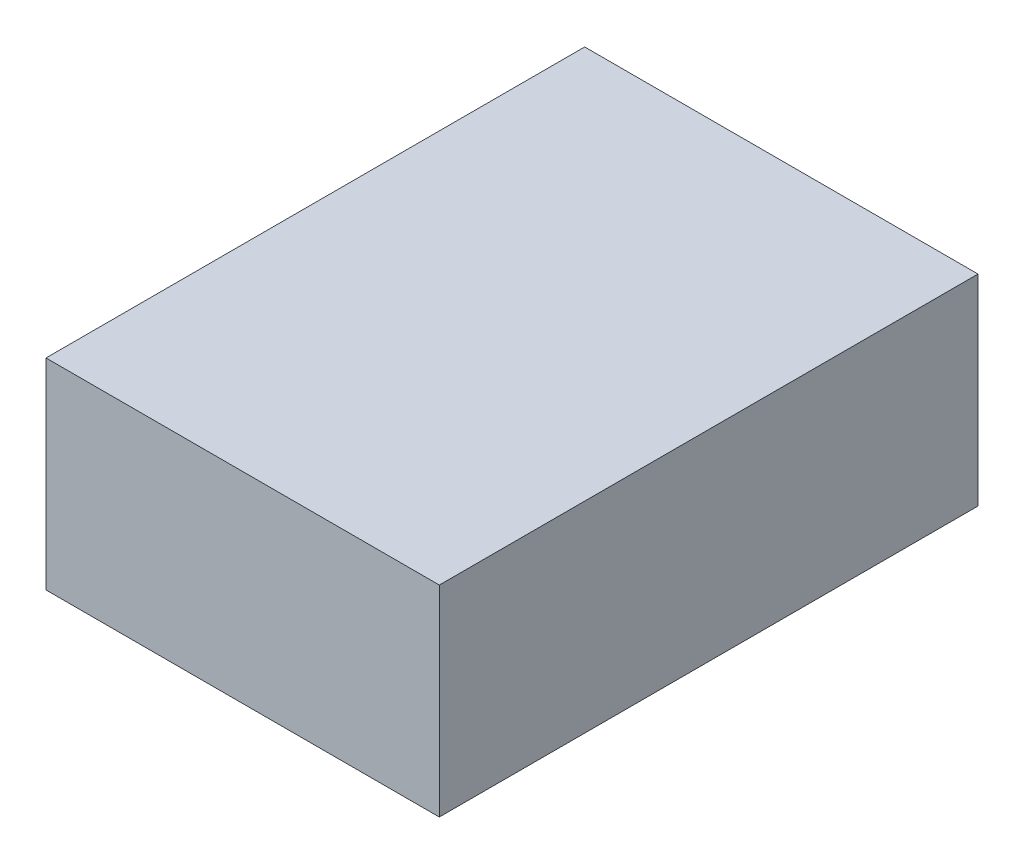
ISO-10303-21;
HEADER;
FILE_DESCRIPTION(('STEP AP214'),'2;1');
FILE_NAME('part.step','',(''),(''),'','','');
FILE_SCHEMA(('AUTOMOTIVE_DESIGN { 1 0 10303 214 1 1 1 1 }'));
ENDSEC;
DATA;
#1=APPLICATION_CONTEXT('core data for automotive mechanical design processes');
#2=APPLICATION_PROTOCOL_DEFINITION('international standard','automotive_design',2000,#1);
#3=PRODUCT_CONTEXT('',#1,'mechanical');
#4=PRODUCT('Part','Part','',(#3));
#5=PRODUCT_RELATED_PRODUCT_CATEGORY('part','',(#4));
#6=PRODUCT_DEFINITION_FORMATION('','',#4);
#7=PRODUCT_DEFINITION_CONTEXT('part definition',#1,'design');
#8=PRODUCT_DEFINITION('design','',#6,#7);
#9=PRODUCT_DEFINITION_SHAPE('','',#8);
#10=(LENGTH_UNIT() NAMED_UNIT(*) SI_UNIT(.MILLI.,.METRE.));
#11=(NAMED_UNIT(*) PLANE_ANGLE_UNIT() SI_UNIT($,.RADIAN.));
#12=(NAMED_UNIT(*) SI_UNIT($,.STERADIAN.) SOLID_ANGLE_UNIT());
#13=UNCERTAINTY_MEASURE_WITH_UNIT(LENGTH_MEASURE(1.E-05),#10,'distance_accuracy_value','');
#14=(GEOMETRIC_REPRESENTATION_CONTEXT(3) GLOBAL_UNCERTAINTY_ASSIGNED_CONTEXT((#13)) GLOBAL_UNIT_ASSIGNED_CONTEXT((#10,
#11,#12)) REPRESENTATION_CONTEXT('',''));
#15=CARTESIAN_POINT('',(0.,0.,0.));
#16=DIRECTION('',(0.,0.,1.));
#17=DIRECTION('',(1.,0.,0.));
#18=AXIS2_PLACEMENT_3D('',#15,#16,#17);
#19=CARTESIAN_POINT('',(-23.,23.5,-31.5));
#20=DIRECTION('',(1.,0.,0.));
#21=DIRECTION('',(0.,0.,-1.));
#22=AXIS2_PLACEMENT_3D('',#19,#20,#21);
#23=PLANE('',#22);
#24=DIRECTION('',(0.,0.,1.));
#25=VECTOR('',#24,1.);
#26=CARTESIAN_POINT('',(-23.,0.,-31.5));
#27=LINE('',#26,#25);
#28=CARTESIAN_POINT('',(-23.,0.,-31.5));
#29=VERTEX_POINT('',#28);
#30=CARTESIAN_POINT('',(-23.,0.,31.5));
#31=VERTEX_POINT('',#30);
#32=EDGE_CURVE('E102',#29,#31,#27,.T.);
#33=ORIENTED_EDGE('',*,*,#32,.T.);
#34=DIRECTION('',(0.,-1.,0.));
#35=VECTOR('',#34,1.);
#36=CARTESIAN_POINT('',(-23.,23.5,31.5));
#37=LINE('',#36,#35);
#38=CARTESIAN_POINT('',(-23.,23.5,31.5));
#39=VERTEX_POINT('',#38);
#40=EDGE_CURVE('E11',#39,#31,#37,.T.);
#41=ORIENTED_EDGE('',*,*,#40,.F.);
#42=DIRECTION('',(0.,0.,1.));
#43=VECTOR('',#42,1.);
#44=CARTESIAN_POINT('',(-23.,23.5,-31.5));
#45=LINE('',#44,#43);
#46=CARTESIAN_POINT('',(-23.,23.5,-31.5));
#47=VERTEX_POINT('',#46);
#48=EDGE_CURVE('E90',#47,#39,#45,.T.);
#49=ORIENTED_EDGE('',*,*,#48,.F.);
#50=DIRECTION('',(0.,-1.,0.));
#51=VECTOR('',#50,1.);
#52=CARTESIAN_POINT('',(-23.,23.5,-31.5));
#53=LINE('',#52,#51);
#54=EDGE_CURVE('E98',#47,#29,#53,.T.);
#55=ORIENTED_EDGE('',*,*,#54,.T.);
#56=EDGE_LOOP('',(#33,#41,#49,#55));
#57=FACE_BOUND('',#56,.T.);
#58=ADVANCED_FACE('F39',(#57),#23,.F.);
#59=CARTESIAN_POINT('',(-23.,23.5,31.5));
#60=DIRECTION('',(0.,0.,-1.));
#61=DIRECTION('',(-1.,0.,0.));
#62=AXIS2_PLACEMENT_3D('',#59,#60,#61);
#63=PLANE('',#62);
#64=DIRECTION('',(1.,0.,0.));
#65=VECTOR('',#64,1.);
#66=CARTESIAN_POINT('',(-23.,0.,31.5));
#67=LINE('',#66,#65);
#68=CARTESIAN_POINT('',(23.,0.,31.5));
#69=VERTEX_POINT('',#68);
#70=EDGE_CURVE('E94',#31,#69,#67,.T.);
#71=ORIENTED_EDGE('',*,*,#70,.T.);
#72=DIRECTION('',(0.,-1.,0.));
#73=VECTOR('',#72,1.);
#74=CARTESIAN_POINT('',(23.,23.5,31.5));
#75=LINE('',#74,#73);
#76=CARTESIAN_POINT('',(23.,23.5,31.5));
#77=VERTEX_POINT('',#76);
#78=EDGE_CURVE('E47',#77,#69,#75,.T.);
#79=ORIENTED_EDGE('',*,*,#78,.F.);
#80=DIRECTION('',(1.,0.,0.));
#81=VECTOR('',#80,1.);
#82=CARTESIAN_POINT('',(-23.,23.5,31.5));
#83=LINE('',#82,#81);
#84=EDGE_CURVE('E85',#39,#77,#83,.T.);
#85=ORIENTED_EDGE('',*,*,#84,.F.);
#86=ORIENTED_EDGE('',*,*,#40,.T.);
#87=EDGE_LOOP('',(#71,#79,#85,#86));
#88=FACE_BOUND('',#87,.T.);
#89=ADVANCED_FACE('F93',(#88),#63,.F.);
#90=CARTESIAN_POINT('',(23.,23.5,-31.5));
#91=DIRECTION('',(-1.,0.,0.));
#92=DIRECTION('',(0.,0.,1.));
#93=AXIS2_PLACEMENT_3D('',#90,#91,#92);
#94=PLANE('',#93);
#95=DIRECTION('',(0.,0.,-1.));
#96=VECTOR('',#95,1.);
#97=CARTESIAN_POINT('',(23.,0.,-31.5));
#98=LINE('',#97,#96);
#99=CARTESIAN_POINT('',(23.,0.,-31.5));
#100=VERTEX_POINT('',#99);
#101=EDGE_CURVE('E72',#69,#100,#98,.T.);
#102=ORIENTED_EDGE('',*,*,#101,.T.);
#103=DIRECTION('',(0.,-1.,0.));
#104=VECTOR('',#103,1.);
#105=CARTESIAN_POINT('',(23.,23.5,-31.5));
#106=LINE('',#105,#104);
#107=CARTESIAN_POINT('',(23.,23.5,-31.5));
#108=VERTEX_POINT('',#107);
#109=EDGE_CURVE('E95',#108,#100,#106,.T.);
#110=ORIENTED_EDGE('',*,*,#109,.F.);
#111=DIRECTION('',(0.,0.,-1.));
#112=VECTOR('',#111,1.);
#113=CARTESIAN_POINT('',(23.,23.5,-31.5));
#114=LINE('',#113,#112);
#115=EDGE_CURVE('E88',#77,#108,#114,.T.);
#116=ORIENTED_EDGE('',*,*,#115,.F.);
#117=ORIENTED_EDGE('',*,*,#78,.T.);
#118=EDGE_LOOP('',(#102,#110,#116,#117));
#119=FACE_BOUND('',#118,.T.);
#120=ADVANCED_FACE('F96',(#119),#94,.F.);
#121=CARTESIAN_POINT('',(-23.,23.5,-31.5));
#122=DIRECTION('',(0.,0.,1.));
#123=DIRECTION('',(1.,0.,0.));
#124=AXIS2_PLACEMENT_3D('',#121,#122,#123);
#125=PLANE('',#124);
#126=DIRECTION('',(-1.,0.,0.));
#127=VECTOR('',#126,1.);
#128=CARTESIAN_POINT('',(-23.,0.,-31.5));
#129=LINE('',#128,#127);
#130=EDGE_CURVE('E78',#100,#29,#129,.T.);
#131=ORIENTED_EDGE('',*,*,#130,.T.);
#132=ORIENTED_EDGE('',*,*,#54,.F.);
#133=DIRECTION('',(-1.,0.,0.));
#134=VECTOR('',#133,1.);
#135=CARTESIAN_POINT('',(-23.,23.5,-31.5));
#136=LINE('',#135,#134);
#137=EDGE_CURVE('E55',#108,#47,#136,.T.);
#138=ORIENTED_EDGE('',*,*,#137,.F.);
#139=ORIENTED_EDGE('',*,*,#109,.T.);
#140=EDGE_LOOP('',(#131,#132,#138,#139));
#141=FACE_BOUND('',#140,.T.);
#142=ADVANCED_FACE('F109',(#141),#125,.F.);
#143=CARTESIAN_POINT('',(0.,23.5,0.));
#144=DIRECTION('',(0.,1.,0.));
#145=DIRECTION('',(0.,0.,1.));
#146=AXIS2_PLACEMENT_3D('',#143,#144,#145);
#147=PLANE('',#146);
#148=ORIENTED_EDGE('',*,*,#48,.T.);
#149=ORIENTED_EDGE('',*,*,#84,.T.);
#150=ORIENTED_EDGE('',*,*,#115,.T.);
#151=ORIENTED_EDGE('',*,*,#137,.T.);
#152=EDGE_LOOP('',(#148,#149,#150,#151));
#153=FACE_BOUND('',#152,.T.);
#154=ADVANCED_FACE('F86',(#153),#147,.T.);
#155=CARTESIAN_POINT('',(0.,0.,0.));
#156=DIRECTION('',(0.,1.,0.));
#157=DIRECTION('',(0.,0.,1.));
#158=AXIS2_PLACEMENT_3D('',#155,#156,#157);
#159=PLANE('',#158);
#160=ORIENTED_EDGE('',*,*,#32,.F.);
#161=ORIENTED_EDGE('',*,*,#130,.F.);
#162=ORIENTED_EDGE('',*,*,#101,.F.);
#163=ORIENTED_EDGE('',*,*,#70,.F.);
#164=EDGE_LOOP('',(#160,#161,#162,#163));
#165=FACE_BOUND('',#164,.T.);
#166=ADVANCED_FACE('F112',(#165),#159,.F.);
#167=CLOSED_SHELL('',(#58,#89,#120,#142,#154,#166));
#168=MANIFOLD_SOLID_BREP('B2',#167);
#169=ADVANCED_BREP_SHAPE_REPRESENTATION('',(#18,#168),#14);
#170=SHAPE_DEFINITION_REPRESENTATION(#9,#169);
ENDSEC;
END-ISO-10303-21;
